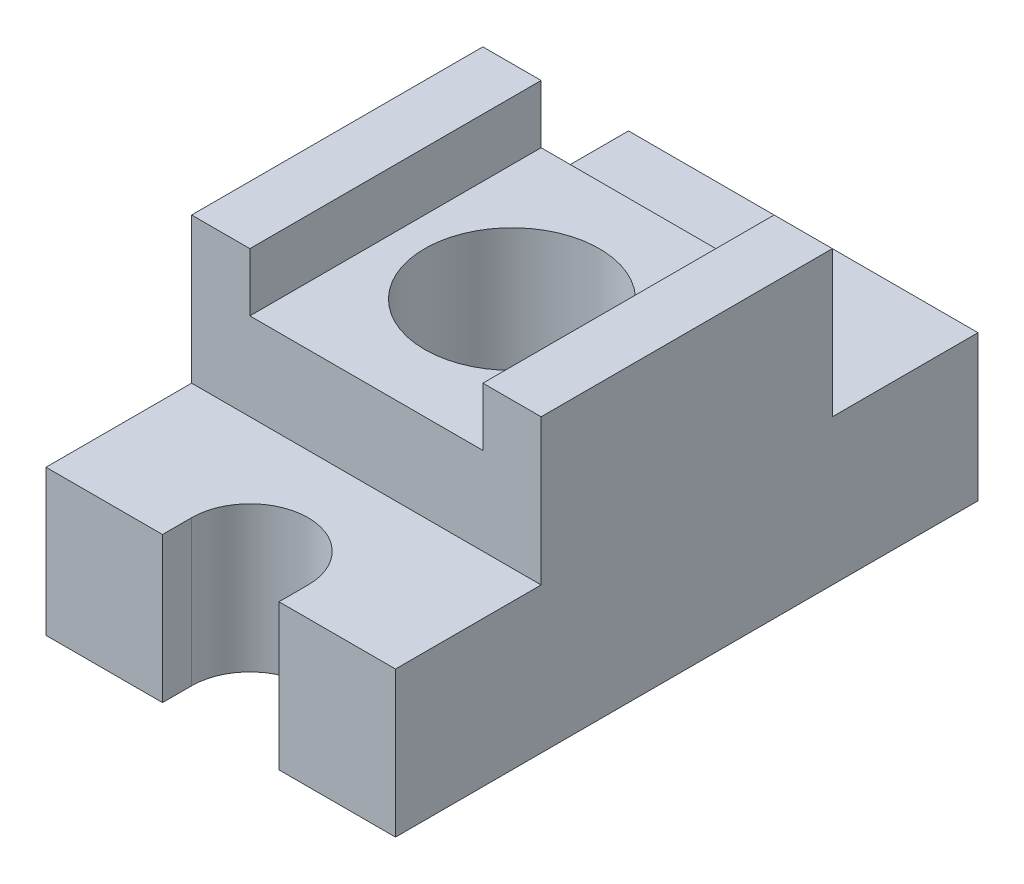
ISO-10303-21;
HEADER;
FILE_DESCRIPTION(('STEP AP214'),'2;1');
FILE_NAME('part.step','',(''),(''),'','','');
FILE_SCHEMA(('AUTOMOTIVE_DESIGN { 1 0 10303 214 1 1 1 1 }'));
ENDSEC;
DATA;
#1=APPLICATION_CONTEXT('core data for automotive mechanical design processes');
#2=APPLICATION_PROTOCOL_DEFINITION('international standard','automotive_design',2000,#1);
#3=PRODUCT_CONTEXT('',#1,'mechanical');
#4=PRODUCT('Part','Part','',(#3));
#5=PRODUCT_RELATED_PRODUCT_CATEGORY('part','',(#4));
#6=PRODUCT_DEFINITION_FORMATION('','',#4);
#7=PRODUCT_DEFINITION_CONTEXT('part definition',#1,'design');
#8=PRODUCT_DEFINITION('design','',#6,#7);
#9=PRODUCT_DEFINITION_SHAPE('','',#8);
#10=(LENGTH_UNIT() NAMED_UNIT(*) SI_UNIT(.MILLI.,.METRE.));
#11=(NAMED_UNIT(*) PLANE_ANGLE_UNIT() SI_UNIT($,.RADIAN.));
#12=(NAMED_UNIT(*) SI_UNIT($,.STERADIAN.) SOLID_ANGLE_UNIT());
#13=UNCERTAINTY_MEASURE_WITH_UNIT(LENGTH_MEASURE(1.E-05),#10,'distance_accuracy_value','');
#14=(GEOMETRIC_REPRESENTATION_CONTEXT(3) GLOBAL_UNCERTAINTY_ASSIGNED_CONTEXT((#13)) GLOBAL_UNIT_ASSIGNED_CONTEXT((#10,
#11,#12)) REPRESENTATION_CONTEXT('',''));
#15=CARTESIAN_POINT('',(0.,0.,0.));
#16=DIRECTION('',(0.,0.,1.));
#17=DIRECTION('',(1.,0.,0.));
#18=AXIS2_PLACEMENT_3D('',#15,#16,#17);
#19=CARTESIAN_POINT('',(60.,25.,25.));
#20=DIRECTION('',(0.,1.,0.));
#21=DIRECTION('',(0.,0.,1.));
#22=AXIS2_PLACEMENT_3D('',#19,#20,#21);
#23=PLANE('',#22);
#24=DIRECTION('',(0.,0.,-1.));
#25=VECTOR('',#24,1.);
#26=CARTESIAN_POINT('',(50.,25.,25.));
#27=LINE('',#26,#25);
#28=CARTESIAN_POINT('',(50.,25.,25.));
#29=VERTEX_POINT('',#28);
#30=CARTESIAN_POINT('',(50.,25.,-25.));
#31=VERTEX_POINT('',#30);
#32=EDGE_CURVE('E158',#29,#31,#27,.T.);
#33=ORIENTED_EDGE('',*,*,#32,.F.);
#34=DIRECTION('',(-1.,0.,0.));
#35=VECTOR('',#34,1.);
#36=CARTESIAN_POINT('',(60.,25.,25.));
#37=LINE('',#36,#35);
#38=CARTESIAN_POINT('',(60.,25.,25.));
#39=VERTEX_POINT('',#38);
#40=EDGE_CURVE('E306',#39,#29,#37,.T.);
#41=ORIENTED_EDGE('',*,*,#40,.F.);
#42=DIRECTION('',(0.,0.,-1.));
#43=VECTOR('',#42,1.);
#44=CARTESIAN_POINT('',(60.,25.,25.));
#45=LINE('',#44,#43);
#46=CARTESIAN_POINT('',(60.,25.,-25.));
#47=VERTEX_POINT('',#46);
#48=EDGE_CURVE('E242',#39,#47,#45,.T.);
#49=ORIENTED_EDGE('',*,*,#48,.T.);
#50=DIRECTION('',(-1.,0.,0.));
#51=VECTOR('',#50,1.);
#52=CARTESIAN_POINT('',(60.,25.,-25.));
#53=LINE('',#52,#51);
#54=EDGE_CURVE('E302',#47,#31,#53,.T.);
#55=ORIENTED_EDGE('',*,*,#54,.T.);
#56=EDGE_LOOP('',(#33,#41,#49,#55));
#57=FACE_BOUND('',#56,.T.);
#58=ADVANCED_FACE('F39',(#57),#23,.T.);
#59=CARTESIAN_POINT('',(60.,-25.,50.));
#60=DIRECTION('',(0.,0.,1.));
#61=DIRECTION('',(1.,0.,0.));
#62=AXIS2_PLACEMENT_3D('',#59,#60,#61);
#63=PLANE('',#62);
#64=DIRECTION('',(0.,1.,0.));
#65=VECTOR('',#64,1.);
#66=CARTESIAN_POINT('',(40.,-25.,50.));
#67=LINE('',#66,#65);
#68=CARTESIAN_POINT('',(40.,-25.,50.));
#69=VERTEX_POINT('',#68);
#70=CARTESIAN_POINT('',(40.,0.,50.));
#71=VERTEX_POINT('',#70);
#72=EDGE_CURVE('E225',#69,#71,#67,.T.);
#73=ORIENTED_EDGE('',*,*,#72,.F.);
#74=DIRECTION('',(-1.,0.,0.));
#75=VECTOR('',#74,1.);
#76=CARTESIAN_POINT('',(60.,-25.,50.));
#77=LINE('',#76,#75);
#78=CARTESIAN_POINT('',(60.,-25.,50.));
#79=VERTEX_POINT('',#78);
#80=EDGE_CURVE('E48',#79,#69,#77,.T.);
#81=ORIENTED_EDGE('',*,*,#80,.F.);
#82=DIRECTION('',(0.,1.,0.));
#83=VECTOR('',#82,1.);
#84=CARTESIAN_POINT('',(60.,-25.,50.));
#85=LINE('',#84,#83);
#86=CARTESIAN_POINT('',(60.,0.,50.));
#87=VERTEX_POINT('',#86);
#88=EDGE_CURVE('E229',#79,#87,#85,.T.);
#89=ORIENTED_EDGE('',*,*,#88,.T.);
#90=DIRECTION('',(-1.,0.,0.));
#91=VECTOR('',#90,1.);
#92=CARTESIAN_POINT('',(60.,0.,50.));
#93=LINE('',#92,#91);
#94=EDGE_CURVE('E313',#87,#71,#93,.T.);
#95=ORIENTED_EDGE('',*,*,#94,.T.);
#96=EDGE_LOOP('',(#73,#81,#89,#95));
#97=FACE_BOUND('',#96,.T.);
#98=ADVANCED_FACE('F349',(#97),#63,.T.);
#99=DIRECTION('',(0.,-1.,0.));
#100=VECTOR('',#99,1.);
#101=CARTESIAN_POINT('',(20.,-25.,50.));
#102=LINE('',#101,#100);
#103=CARTESIAN_POINT('',(20.,0.,50.));
#104=VERTEX_POINT('',#103);
#105=CARTESIAN_POINT('',(20.,-25.,50.));
#106=VERTEX_POINT('',#105);
#107=EDGE_CURVE('E220',#104,#106,#102,.T.);
#108=ORIENTED_EDGE('',*,*,#107,.F.);
#109=CARTESIAN_POINT('',(0.,0.,50.));
#110=VERTEX_POINT('',#109);
#111=EDGE_CURVE('E258',#104,#110,#93,.T.);
#112=ORIENTED_EDGE('',*,*,#111,.T.);
#113=DIRECTION('',(0.,1.,0.));
#114=VECTOR('',#113,1.);
#115=CARTESIAN_POINT('',(0.,-25.,50.));
#116=LINE('',#115,#114);
#117=CARTESIAN_POINT('',(0.,-25.,50.));
#118=VERTEX_POINT('',#117);
#119=EDGE_CURVE('E228',#118,#110,#116,.T.);
#120=ORIENTED_EDGE('',*,*,#119,.F.);
#121=EDGE_CURVE('E289',#106,#118,#77,.T.);
#122=ORIENTED_EDGE('',*,*,#121,.F.);
#123=EDGE_LOOP('',(#108,#112,#120,#122));
#124=FACE_BOUND('',#123,.T.);
#125=ADVANCED_FACE('F41',(#124),#63,.T.);
#126=CARTESIAN_POINT('',(60.,-25.,50.));
#127=DIRECTION('',(0.,1.,0.));
#128=DIRECTION('',(0.,0.,1.));
#129=AXIS2_PLACEMENT_3D('',#126,#127,#128);
#130=PLANE('',#129);
#131=CARTESIAN_POINT('',(30.,-25.,0.));
#132=DIRECTION('',(0.,1.,0.));
#133=DIRECTION('',(0.,0.,1.));
#134=AXIS2_PLACEMENT_3D('',#131,#132,#133);
#135=CIRCLE('',#134,15.);
#136=CARTESIAN_POINT('',(30.,-25.,15.));
#137=VERTEX_POINT('',#136);
#138=EDGE_CURVE('E187',#137,#137,#135,.T.);
#139=ORIENTED_EDGE('',*,*,#138,.T.);
#140=EDGE_LOOP('',(#139));
#141=FACE_BOUND('',#140,.T.);
#142=ORIENTED_EDGE('',*,*,#80,.T.);
#143=DIRECTION('',(0.,0.,-1.));
#144=VECTOR('',#143,1.);
#145=CARTESIAN_POINT('',(40.,-25.,45.));
#146=LINE('',#145,#144);
#147=CARTESIAN_POINT('',(40.,-25.,45.));
#148=VERTEX_POINT('',#147);
#149=EDGE_CURVE('E208',#69,#148,#146,.T.);
#150=ORIENTED_EDGE('',*,*,#149,.T.);
#151=CARTESIAN_POINT('',(30.,-25.,45.));
#152=DIRECTION('',(0.,1.,0.));
#153=DIRECTION('',(0.,0.,1.));
#154=AXIS2_PLACEMENT_3D('',#151,#152,#153);
#155=CIRCLE('',#154,10.);
#156=CARTESIAN_POINT('',(20.,-25.,45.));
#157=VERTEX_POINT('',#156);
#158=EDGE_CURVE('E199',#148,#157,#155,.T.);
#159=ORIENTED_EDGE('',*,*,#158,.T.);
#160=DIRECTION('',(0.,0.,1.));
#161=VECTOR('',#160,1.);
#162=CARTESIAN_POINT('',(20.,-25.,45.));
#163=LINE('',#162,#161);
#164=EDGE_CURVE('E203',#157,#106,#163,.T.);
#165=ORIENTED_EDGE('',*,*,#164,.T.);
#166=ORIENTED_EDGE('',*,*,#121,.T.);
#167=DIRECTION('',(0.,0.,-1.));
#168=VECTOR('',#167,1.);
#169=CARTESIAN_POINT('',(0.,-25.,50.));
#170=LINE('',#169,#168);
#171=CARTESIAN_POINT('',(0.,-25.,-50.));
#172=VERTEX_POINT('',#171);
#173=EDGE_CURVE('E234',#118,#172,#170,.T.);
#174=ORIENTED_EDGE('',*,*,#173,.T.);
#175=DIRECTION('',(-1.,0.,0.));
#176=VECTOR('',#175,1.);
#177=CARTESIAN_POINT('',(60.,-25.,-50.));
#178=LINE('',#177,#176);
#179=CARTESIAN_POINT('',(60.,-25.,-50.));
#180=VERTEX_POINT('',#179);
#181=EDGE_CURVE('E290',#180,#172,#178,.T.);
#182=ORIENTED_EDGE('',*,*,#181,.F.);
#183=DIRECTION('',(0.,0.,-1.));
#184=VECTOR('',#183,1.);
#185=CARTESIAN_POINT('',(60.,-25.,50.));
#186=LINE('',#185,#184);
#187=EDGE_CURVE('E255',#79,#180,#186,.T.);
#188=ORIENTED_EDGE('',*,*,#187,.F.);
#189=EDGE_LOOP('',(#142,#150,#159,#165,#166,#174,#182,#188));
#190=FACE_BOUND('',#189,.T.);
#191=ADVANCED_FACE('F337',(#141,#190),#130,.F.);
#192=CARTESIAN_POINT('',(60.,-25.,-50.));
#193=DIRECTION('',(0.,0.,1.));
#194=DIRECTION('',(0.,-1.,0.));
#195=AXIS2_PLACEMENT_3D('',#192,#193,#194);
#196=PLANE('',#195);
#197=DIRECTION('',(0.,1.,0.));
#198=VECTOR('',#197,1.);
#199=CARTESIAN_POINT('',(0.,-25.,-50.));
#200=LINE('',#199,#198);
#201=CARTESIAN_POINT('',(0.,0.,-50.));
#202=VERTEX_POINT('',#201);
#203=EDGE_CURVE('E281',#172,#202,#200,.T.);
#204=ORIENTED_EDGE('',*,*,#203,.T.);
#205=DIRECTION('',(-1.,0.,0.));
#206=VECTOR('',#205,1.);
#207=CARTESIAN_POINT('',(60.,0.,-50.));
#208=LINE('',#207,#206);
#209=CARTESIAN_POINT('',(60.,0.,-50.));
#210=VERTEX_POINT('',#209);
#211=EDGE_CURVE('E294',#210,#202,#208,.T.);
#212=ORIENTED_EDGE('',*,*,#211,.F.);
#213=DIRECTION('',(0.,1.,0.));
#214=VECTOR('',#213,1.);
#215=CARTESIAN_POINT('',(60.,-25.,-50.));
#216=LINE('',#215,#214);
#217=EDGE_CURVE('E252',#180,#210,#216,.T.);
#218=ORIENTED_EDGE('',*,*,#217,.F.);
#219=ORIENTED_EDGE('',*,*,#181,.T.);
#220=EDGE_LOOP('',(#204,#212,#218,#219));
#221=FACE_BOUND('',#220,.T.);
#222=ADVANCED_FACE('F341',(#221),#196,.F.);
#223=CARTESIAN_POINT('',(60.,0.,-50.));
#224=DIRECTION('',(0.,-1.,0.));
#225=DIRECTION('',(0.,0.,-1.));
#226=AXIS2_PLACEMENT_3D('',#223,#224,#225);
#227=PLANE('',#226);
#228=DIRECTION('',(0.,0.,1.));
#229=VECTOR('',#228,1.);
#230=CARTESIAN_POINT('',(0.,0.,-50.));
#231=LINE('',#230,#229);
#232=CARTESIAN_POINT('',(0.,0.,-25.));
#233=VERTEX_POINT('',#232);
#234=EDGE_CURVE('E278',#202,#233,#231,.T.);
#235=ORIENTED_EDGE('',*,*,#234,.T.);
#236=DIRECTION('',(-1.,0.,0.));
#237=VECTOR('',#236,1.);
#238=CARTESIAN_POINT('',(60.,0.,-25.));
#239=LINE('',#238,#237);
#240=CARTESIAN_POINT('',(60.,0.,-25.));
#241=VERTEX_POINT('',#240);
#242=EDGE_CURVE('E298',#241,#233,#239,.T.);
#243=ORIENTED_EDGE('',*,*,#242,.F.);
#244=DIRECTION('',(0.,0.,1.));
#245=VECTOR('',#244,1.);
#246=CARTESIAN_POINT('',(60.,0.,-50.));
#247=LINE('',#246,#245);
#248=EDGE_CURVE('E249',#210,#241,#247,.T.);
#249=ORIENTED_EDGE('',*,*,#248,.F.);
#250=ORIENTED_EDGE('',*,*,#211,.T.);
#251=EDGE_LOOP('',(#235,#243,#249,#250));
#252=FACE_BOUND('',#251,.T.);
#253=ADVANCED_FACE('F370',(#252),#227,.F.);
#254=CARTESIAN_POINT('',(60.,0.,-25.));
#255=DIRECTION('',(0.,0.,1.));
#256=DIRECTION('',(1.,0.,0.));
#257=AXIS2_PLACEMENT_3D('',#254,#255,#256);
#258=PLANE('',#257);
#259=DIRECTION('',(-1.,0.,0.));
#260=VECTOR('',#259,1.);
#261=CARTESIAN_POINT('',(9.99999999999999,15.,-25.));
#262=LINE('',#261,#260);
#263=CARTESIAN_POINT('',(50.,15.,-25.));
#264=VERTEX_POINT('',#263);
#265=CARTESIAN_POINT('',(9.99999999999999,15.,-25.));
#266=VERTEX_POINT('',#265);
#267=EDGE_CURVE('E168',#264,#266,#262,.T.);
#268=ORIENTED_EDGE('',*,*,#267,.F.);
#269=DIRECTION('',(0.,1.,0.));
#270=VECTOR('',#269,1.);
#271=CARTESIAN_POINT('',(50.,15.,-25.));
#272=LINE('',#271,#270);
#273=EDGE_CURVE('E153',#264,#31,#272,.T.);
#274=ORIENTED_EDGE('',*,*,#273,.T.);
#275=ORIENTED_EDGE('',*,*,#54,.F.);
#276=DIRECTION('',(0.,1.,0.));
#277=VECTOR('',#276,1.);
#278=CARTESIAN_POINT('',(60.,0.,-25.));
#279=LINE('',#278,#277);
#280=EDGE_CURVE('E246',#241,#47,#279,.T.);
#281=ORIENTED_EDGE('',*,*,#280,.F.);
#282=ORIENTED_EDGE('',*,*,#242,.T.);
#283=DIRECTION('',(0.,1.,0.));
#284=VECTOR('',#283,1.);
#285=CARTESIAN_POINT('',(0.,0.,-25.));
#286=LINE('',#285,#284);
#287=CARTESIAN_POINT('',(0.,25.,-25.));
#288=VERTEX_POINT('',#287);
#289=EDGE_CURVE('E274',#233,#288,#286,.T.);
#290=ORIENTED_EDGE('',*,*,#289,.T.);
#291=CARTESIAN_POINT('',(9.99999999999999,25.,-25.));
#292=VERTEX_POINT('',#291);
#293=EDGE_CURVE('E305',#292,#288,#53,.T.);
#294=ORIENTED_EDGE('',*,*,#293,.F.);
#295=DIRECTION('',(0.,1.,0.));
#296=VECTOR('',#295,1.);
#297=CARTESIAN_POINT('',(9.99999999999999,15.,-25.));
#298=LINE('',#297,#296);
#299=EDGE_CURVE('E164',#266,#292,#298,.T.);
#300=ORIENTED_EDGE('',*,*,#299,.F.);
#301=EDGE_LOOP('',(#268,#274,#275,#281,#282,#290,#294,#300));
#302=FACE_BOUND('',#301,.T.);
#303=ADVANCED_FACE('F175',(#302),#258,.F.);
#304=DIRECTION('',(0.,0.,1.));
#305=VECTOR('',#304,1.);
#306=CARTESIAN_POINT('',(9.99999999999999,25.,25.));
#307=LINE('',#306,#305);
#308=CARTESIAN_POINT('',(9.99999999999999,25.,25.));
#309=VERTEX_POINT('',#308);
#310=EDGE_CURVE('E173',#292,#309,#307,.T.);
#311=ORIENTED_EDGE('',*,*,#310,.F.);
#312=ORIENTED_EDGE('',*,*,#293,.T.);
#313=DIRECTION('',(0.,0.,-1.));
#314=VECTOR('',#313,1.);
#315=CARTESIAN_POINT('',(0.,25.,25.));
#316=LINE('',#315,#314);
#317=CARTESIAN_POINT('',(0.,25.,25.));
#318=VERTEX_POINT('',#317);
#319=EDGE_CURVE('E270',#318,#288,#316,.T.);
#320=ORIENTED_EDGE('',*,*,#319,.F.);
#321=EDGE_CURVE('E310',#309,#318,#37,.T.);
#322=ORIENTED_EDGE('',*,*,#321,.F.);
#323=EDGE_LOOP('',(#311,#312,#320,#322));
#324=FACE_BOUND('',#323,.T.);
#325=ADVANCED_FACE('F366',(#324),#23,.T.);
#326=CARTESIAN_POINT('',(60.,0.,25.));
#327=DIRECTION('',(0.,0.,1.));
#328=DIRECTION('',(1.,0.,0.));
#329=AXIS2_PLACEMENT_3D('',#326,#327,#328);
#330=PLANE('',#329);
#331=DIRECTION('',(0.,1.,0.));
#332=VECTOR('',#331,1.);
#333=CARTESIAN_POINT('',(50.,15.,25.));
#334=LINE('',#333,#332);
#335=CARTESIAN_POINT('',(50.,15.,25.));
#336=VERTEX_POINT('',#335);
#337=EDGE_CURVE('E190',#336,#29,#334,.T.);
#338=ORIENTED_EDGE('',*,*,#337,.F.);
#339=DIRECTION('',(1.,0.,0.));
#340=VECTOR('',#339,1.);
#341=CARTESIAN_POINT('',(9.99999999999999,15.,25.));
#342=LINE('',#341,#340);
#343=CARTESIAN_POINT('',(9.99999999999999,15.,25.));
#344=VERTEX_POINT('',#343);
#345=EDGE_CURVE('E165',#344,#336,#342,.T.);
#346=ORIENTED_EDGE('',*,*,#345,.F.);
#347=DIRECTION('',(0.,1.,0.));
#348=VECTOR('',#347,1.);
#349=CARTESIAN_POINT('',(9.99999999999999,15.,25.));
#350=LINE('',#349,#348);
#351=EDGE_CURVE('E193',#344,#309,#350,.T.);
#352=ORIENTED_EDGE('',*,*,#351,.T.);
#353=ORIENTED_EDGE('',*,*,#321,.T.);
#354=DIRECTION('',(0.,1.,0.));
#355=VECTOR('',#354,1.);
#356=CARTESIAN_POINT('',(0.,0.,25.));
#357=LINE('',#356,#355);
#358=CARTESIAN_POINT('',(0.,0.,25.));
#359=VERTEX_POINT('',#358);
#360=EDGE_CURVE('E266',#359,#318,#357,.T.);
#361=ORIENTED_EDGE('',*,*,#360,.F.);
#362=DIRECTION('',(-1.,0.,0.));
#363=VECTOR('',#362,1.);
#364=CARTESIAN_POINT('',(60.,0.,25.));
#365=LINE('',#364,#363);
#366=CARTESIAN_POINT('',(60.,0.,25.));
#367=VERTEX_POINT('',#366);
#368=EDGE_CURVE('E311',#367,#359,#365,.T.);
#369=ORIENTED_EDGE('',*,*,#368,.F.);
#370=DIRECTION('',(0.,1.,0.));
#371=VECTOR('',#370,1.);
#372=CARTESIAN_POINT('',(60.,0.,25.));
#373=LINE('',#372,#371);
#374=EDGE_CURVE('E238',#367,#39,#373,.T.);
#375=ORIENTED_EDGE('',*,*,#374,.T.);
#376=ORIENTED_EDGE('',*,*,#40,.T.);
#377=EDGE_LOOP('',(#338,#346,#352,#353,#361,#369,#375,#376));
#378=FACE_BOUND('',#377,.T.);
#379=ADVANCED_FACE('F363',(#378),#330,.T.);
#380=CARTESIAN_POINT('',(60.,0.,50.));
#381=DIRECTION('',(0.,1.,0.));
#382=DIRECTION('',(0.,0.,1.));
#383=AXIS2_PLACEMENT_3D('',#380,#381,#382);
#384=PLANE('',#383);
#385=DIRECTION('',(0.,0.,-1.));
#386=VECTOR('',#385,1.);
#387=CARTESIAN_POINT('',(40.,0.,50.));
#388=LINE('',#387,#386);
#389=CARTESIAN_POINT('',(40.,0.,45.));
#390=VERTEX_POINT('',#389);
#391=EDGE_CURVE('E11',#71,#390,#388,.T.);
#392=ORIENTED_EDGE('',*,*,#391,.F.);
#393=ORIENTED_EDGE('',*,*,#94,.F.);
#394=DIRECTION('',(0.,0.,-1.));
#395=VECTOR('',#394,1.);
#396=CARTESIAN_POINT('',(60.,0.,50.));
#397=LINE('',#396,#395);
#398=EDGE_CURVE('E233',#87,#367,#397,.T.);
#399=ORIENTED_EDGE('',*,*,#398,.T.);
#400=ORIENTED_EDGE('',*,*,#368,.T.);
#401=DIRECTION('',(0.,0.,-1.));
#402=VECTOR('',#401,1.);
#403=CARTESIAN_POINT('',(0.,0.,50.));
#404=LINE('',#403,#402);
#405=EDGE_CURVE('E262',#110,#359,#404,.T.);
#406=ORIENTED_EDGE('',*,*,#405,.F.);
#407=ORIENTED_EDGE('',*,*,#111,.F.);
#408=DIRECTION('',(0.,0.,1.));
#409=VECTOR('',#408,1.);
#410=CARTESIAN_POINT('',(20.,0.,45.));
#411=LINE('',#410,#409);
#412=CARTESIAN_POINT('',(20.,0.,45.));
#413=VERTEX_POINT('',#412);
#414=EDGE_CURVE('E204',#413,#104,#411,.T.);
#415=ORIENTED_EDGE('',*,*,#414,.F.);
#416=CARTESIAN_POINT('',(30.,0.,45.));
#417=DIRECTION('',(0.,1.,0.));
#418=DIRECTION('',(0.,0.,1.));
#419=AXIS2_PLACEMENT_3D('',#416,#417,#418);
#420=CIRCLE('',#419,10.);
#421=EDGE_CURVE('E63',#390,#413,#420,.T.);
#422=ORIENTED_EDGE('',*,*,#421,.F.);
#423=EDGE_LOOP('',(#392,#393,#399,#400,#406,#407,#415,#422));
#424=FACE_BOUND('',#423,.T.);
#425=ADVANCED_FACE('F328',(#424),#384,.T.);
#426=CARTESIAN_POINT('',(60.,0.,0.));
#427=DIRECTION('',(-1.,0.,0.));
#428=DIRECTION('',(0.,0.,1.));
#429=AXIS2_PLACEMENT_3D('',#426,#427,#428);
#430=PLANE('',#429);
#431=ORIENTED_EDGE('',*,*,#88,.F.);
#432=ORIENTED_EDGE('',*,*,#187,.T.);
#433=ORIENTED_EDGE('',*,*,#217,.T.);
#434=ORIENTED_EDGE('',*,*,#248,.T.);
#435=ORIENTED_EDGE('',*,*,#280,.T.);
#436=ORIENTED_EDGE('',*,*,#48,.F.);
#437=ORIENTED_EDGE('',*,*,#374,.F.);
#438=ORIENTED_EDGE('',*,*,#398,.F.);
#439=EDGE_LOOP('',(#431,#432,#433,#434,#435,#436,#437,#438));
#440=FACE_BOUND('',#439,.T.);
#441=ADVANCED_FACE('F346',(#440),#430,.F.);
#442=CARTESIAN_POINT('',(0.,0.,0.));
#443=DIRECTION('',(-1.,0.,0.));
#444=DIRECTION('',(0.,0.,1.));
#445=AXIS2_PLACEMENT_3D('',#442,#443,#444);
#446=PLANE('',#445);
#447=ORIENTED_EDGE('',*,*,#119,.T.);
#448=ORIENTED_EDGE('',*,*,#405,.T.);
#449=ORIENTED_EDGE('',*,*,#360,.T.);
#450=ORIENTED_EDGE('',*,*,#319,.T.);
#451=ORIENTED_EDGE('',*,*,#289,.F.);
#452=ORIENTED_EDGE('',*,*,#234,.F.);
#453=ORIENTED_EDGE('',*,*,#203,.F.);
#454=ORIENTED_EDGE('',*,*,#173,.F.);
#455=EDGE_LOOP('',(#447,#448,#449,#450,#451,#452,#453,#454));
#456=FACE_BOUND('',#455,.T.);
#457=ADVANCED_FACE('F332',(#456),#446,.T.);
#458=CARTESIAN_POINT('',(30.,-25.,45.));
#459=DIRECTION('',(0.,1.,0.));
#460=DIRECTION('',(0.,0.,1.));
#461=AXIS2_PLACEMENT_3D('',#458,#459,#460);
#462=CYLINDRICAL_SURFACE('',#461,10.);
#463=ORIENTED_EDGE('',*,*,#421,.T.);
#464=DIRECTION('',(0.,1.,0.));
#465=VECTOR('',#464,1.);
#466=CARTESIAN_POINT('',(20.,-25.,45.));
#467=LINE('',#466,#465);
#468=EDGE_CURVE('E212',#157,#413,#467,.T.);
#469=ORIENTED_EDGE('',*,*,#468,.F.);
#470=ORIENTED_EDGE('',*,*,#158,.F.);
#471=DIRECTION('',(0.,1.,0.));
#472=VECTOR('',#471,1.);
#473=CARTESIAN_POINT('',(40.,-25.,45.));
#474=LINE('',#473,#472);
#475=EDGE_CURVE('E217',#148,#390,#474,.T.);
#476=ORIENTED_EDGE('',*,*,#475,.T.);
#477=EDGE_LOOP('',(#463,#469,#470,#476));
#478=FACE_BOUND('',#477,.T.);
#479=ADVANCED_FACE('F356',(#478),#462,.F.);
#480=CARTESIAN_POINT('',(40.,-25.,45.));
#481=DIRECTION('',(1.,0.,0.));
#482=DIRECTION('',(0.,0.,-1.));
#483=AXIS2_PLACEMENT_3D('',#480,#481,#482);
#484=PLANE('',#483);
#485=ORIENTED_EDGE('',*,*,#72,.T.);
#486=ORIENTED_EDGE('',*,*,#391,.T.);
#487=ORIENTED_EDGE('',*,*,#475,.F.);
#488=ORIENTED_EDGE('',*,*,#149,.F.);
#489=EDGE_LOOP('',(#485,#486,#487,#488));
#490=FACE_BOUND('',#489,.T.);
#491=ADVANCED_FACE('F351',(#490),#484,.F.);
#492=CARTESIAN_POINT('',(20.,-25.,45.));
#493=DIRECTION('',(-1.,0.,0.));
#494=DIRECTION('',(0.,0.,1.));
#495=AXIS2_PLACEMENT_3D('',#492,#493,#494);
#496=PLANE('',#495);
#497=ORIENTED_EDGE('',*,*,#107,.T.);
#498=ORIENTED_EDGE('',*,*,#164,.F.);
#499=ORIENTED_EDGE('',*,*,#468,.T.);
#500=ORIENTED_EDGE('',*,*,#414,.T.);
#501=EDGE_LOOP('',(#497,#498,#499,#500));
#502=FACE_BOUND('',#501,.T.);
#503=ADVANCED_FACE('F353',(#502),#496,.F.);
#504=CARTESIAN_POINT('',(50.,15.,25.));
#505=DIRECTION('',(1.,0.,0.));
#506=DIRECTION('',(0.,0.,-1.));
#507=AXIS2_PLACEMENT_3D('',#504,#505,#506);
#508=PLANE('',#507);
#509=ORIENTED_EDGE('',*,*,#32,.T.);
#510=ORIENTED_EDGE('',*,*,#273,.F.);
#511=DIRECTION('',(0.,0.,-1.));
#512=VECTOR('',#511,1.);
#513=CARTESIAN_POINT('',(50.,15.,25.));
#514=LINE('',#513,#512);
#515=EDGE_CURVE('E156',#336,#264,#514,.T.);
#516=ORIENTED_EDGE('',*,*,#515,.F.);
#517=ORIENTED_EDGE('',*,*,#337,.T.);
#518=EDGE_LOOP('',(#509,#510,#516,#517));
#519=FACE_BOUND('',#518,.T.);
#520=ADVANCED_FACE('F155',(#519),#508,.F.);
#521=CARTESIAN_POINT('',(9.99999999999999,15.,25.));
#522=DIRECTION('',(-1.,0.,0.));
#523=DIRECTION('',(0.,0.,1.));
#524=AXIS2_PLACEMENT_3D('',#521,#522,#523);
#525=PLANE('',#524);
#526=ORIENTED_EDGE('',*,*,#310,.T.);
#527=ORIENTED_EDGE('',*,*,#351,.F.);
#528=DIRECTION('',(0.,0.,1.));
#529=VECTOR('',#528,1.);
#530=CARTESIAN_POINT('',(9.99999999999999,15.,25.));
#531=LINE('',#530,#529);
#532=EDGE_CURVE('E55',#266,#344,#531,.T.);
#533=ORIENTED_EDGE('',*,*,#532,.F.);
#534=ORIENTED_EDGE('',*,*,#299,.T.);
#535=EDGE_LOOP('',(#526,#527,#533,#534));
#536=FACE_BOUND('',#535,.T.);
#537=ADVANCED_FACE('F422',(#536),#525,.F.);
#538=CARTESIAN_POINT('',(0.,15.,0.));
#539=DIRECTION('',(0.,-1.,0.));
#540=DIRECTION('',(0.,0.,-1.));
#541=AXIS2_PLACEMENT_3D('',#538,#539,#540);
#542=PLANE('',#541);
#543=CARTESIAN_POINT('',(30.,15.,0.));
#544=DIRECTION('',(0.,1.,0.));
#545=DIRECTION('',(0.,0.,1.));
#546=AXIS2_PLACEMENT_3D('',#543,#544,#545);
#547=CIRCLE('',#546,15.);
#548=CARTESIAN_POINT('',(30.,15.,15.));
#549=VERTEX_POINT('',#548);
#550=EDGE_CURVE('E413',#549,#549,#547,.T.);
#551=ORIENTED_EDGE('',*,*,#550,.F.);
#552=EDGE_LOOP('',(#551));
#553=FACE_BOUND('',#552,.T.);
#554=ORIENTED_EDGE('',*,*,#515,.T.);
#555=ORIENTED_EDGE('',*,*,#267,.T.);
#556=ORIENTED_EDGE('',*,*,#532,.T.);
#557=ORIENTED_EDGE('',*,*,#345,.T.);
#558=EDGE_LOOP('',(#554,#555,#556,#557));
#559=FACE_BOUND('',#558,.T.);
#560=ADVANCED_FACE('F167',(#553,#559),#542,.F.);
#561=CARTESIAN_POINT('',(30.,-25.,0.));
#562=DIRECTION('',(0.,1.,0.));
#563=DIRECTION('',(0.,0.,1.));
#564=AXIS2_PLACEMENT_3D('',#561,#562,#563);
#565=CYLINDRICAL_SURFACE('',#564,15.);
#566=ORIENTED_EDGE('',*,*,#138,.F.);
#567=EDGE_LOOP('',(#566));
#568=FACE_BOUND('',#567,.T.);
#569=ORIENTED_EDGE('',*,*,#550,.T.);
#570=EDGE_LOOP('',(#569));
#571=FACE_BOUND('',#570,.T.);
#572=ADVANCED_FACE('F419',(#568,#571),#565,.F.);
#573=CLOSED_SHELL('',(#58,#98,#125,#191,#222,#253,#303,#325,#379,#425,#441,#457,#479,#491,#503,
#520,#537,#560,#572));
#574=MANIFOLD_SOLID_BREP('B2',#573);
#575=ADVANCED_BREP_SHAPE_REPRESENTATION('',(#18,#574),#14);
#576=SHAPE_DEFINITION_REPRESENTATION(#9,#575);
ENDSEC;
END-ISO-10303-21;
